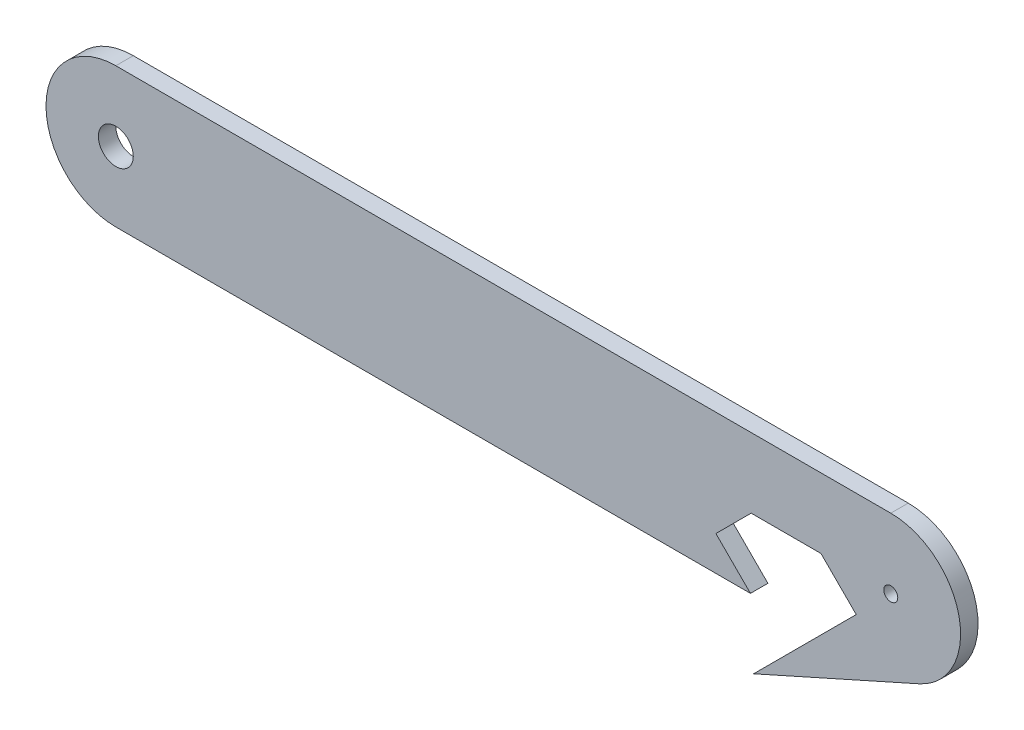
ISO-10303-21;
HEADER;
FILE_DESCRIPTION(('STEP AP214'),'2;1');
FILE_NAME('part.step','',(''),(''),'','','');
FILE_SCHEMA(('AUTOMOTIVE_DESIGN { 1 0 10303 214 1 1 1 1 }'));
ENDSEC;
DATA;
#1=APPLICATION_CONTEXT('core data for automotive mechanical design processes');
#2=APPLICATION_PROTOCOL_DEFINITION('international standard','automotive_design',2000,#1);
#3=PRODUCT_CONTEXT('',#1,'mechanical');
#4=PRODUCT('Part','Part','',(#3));
#5=PRODUCT_RELATED_PRODUCT_CATEGORY('part','',(#4));
#6=PRODUCT_DEFINITION_FORMATION('','',#4);
#7=PRODUCT_DEFINITION_CONTEXT('part definition',#1,'design');
#8=PRODUCT_DEFINITION('design','',#6,#7);
#9=PRODUCT_DEFINITION_SHAPE('','',#8);
#10=(LENGTH_UNIT() NAMED_UNIT(*) SI_UNIT(.MILLI.,.METRE.));
#11=(NAMED_UNIT(*) PLANE_ANGLE_UNIT() SI_UNIT($,.RADIAN.));
#12=(NAMED_UNIT(*) SI_UNIT($,.STERADIAN.) SOLID_ANGLE_UNIT());
#13=UNCERTAINTY_MEASURE_WITH_UNIT(LENGTH_MEASURE(1.E-05),#10,'distance_accuracy_value','');
#14=(GEOMETRIC_REPRESENTATION_CONTEXT(3) GLOBAL_UNCERTAINTY_ASSIGNED_CONTEXT((#13)) GLOBAL_UNIT_ASSIGNED_CONTEXT((#10,
#11,#12)) REPRESENTATION_CONTEXT('',''));
#15=CARTESIAN_POINT('',(0.,0.,0.));
#16=DIRECTION('',(0.,0.,1.));
#17=DIRECTION('',(1.,0.,0.));
#18=AXIS2_PLACEMENT_3D('',#15,#16,#17);
#19=CARTESIAN_POINT('',(140.97,0.,3.175));
#20=DIRECTION('',(0.,0.,1.));
#21=DIRECTION('',(1.,0.,0.));
#22=AXIS2_PLACEMENT_3D('',#19,#20,#21);
#23=PLANE('',#22);
#24=CARTESIAN_POINT('',(140.97,0.,3.175));
#25=DIRECTION('',(0.,0.,1.));
#26=DIRECTION('',(1.,0.,0.));
#27=AXIS2_PLACEMENT_3D('',#24,#25,#26);
#28=CIRCLE('',#27,1.27);
#29=CARTESIAN_POINT('',(142.24,0.,3.175));
#30=VERTEX_POINT('',#29);
#31=EDGE_CURVE('E158',#30,#30,#28,.T.);
#32=ORIENTED_EDGE('',*,*,#31,.F.);
#33=EDGE_LOOP('',(#32));
#34=FACE_BOUND('',#33,.T.);
#35=DIRECTION('',(1.,0.,0.));
#36=VECTOR('',#35,1.);
#37=CARTESIAN_POINT('',(0.,-12.7,3.175));
#38=LINE('',#37,#36);
#39=CARTESIAN_POINT('',(0.,-12.7,3.175));
#40=VERTEX_POINT('',#39);
#41=CARTESIAN_POINT('',(115.442358569436,-12.7,3.175));
#42=VERTEX_POINT('',#41);
#43=EDGE_CURVE('E182',#40,#42,#38,.T.);
#44=ORIENTED_EDGE('',*,*,#43,.T.);
#45=DIRECTION('',(-0.707106781183193,0.707106781189902,0.));
#46=VECTOR('',#45,1.);
#47=CARTESIAN_POINT('',(109.156179284717,-6.41382071522177,3.175));
#48=LINE('',#47,#46);
#49=CARTESIAN_POINT('',(109.156179284717,-6.41382071522177,3.175));
#50=VERTEX_POINT('',#49);
#51=EDGE_CURVE('E106',#42,#50,#48,.T.);
#52=ORIENTED_EDGE('',*,*,#51,.T.);
#53=DIRECTION('',(0.707106781189902,0.707106781183193,0.));
#54=VECTOR('',#53,1.);
#55=CARTESIAN_POINT('',(115.57,0.,3.175));
#56=LINE('',#55,#54);
#57=CARTESIAN_POINT('',(115.57,0.,3.175));
#58=VERTEX_POINT('',#57);
#59=EDGE_CURVE('E211',#50,#58,#56,.T.);
#60=ORIENTED_EDGE('',*,*,#59,.T.);
#61=DIRECTION('',(1.,0.,0.));
#62=VECTOR('',#61,1.);
#63=CARTESIAN_POINT('',(115.57,0.,3.175));
#64=LINE('',#63,#62);
#65=CARTESIAN_POINT('',(128.27,0.,3.175));
#66=VERTEX_POINT('',#65);
#67=EDGE_CURVE('E231',#58,#66,#64,.T.);
#68=ORIENTED_EDGE('',*,*,#67,.T.);
#69=DIRECTION('',(0.707106781183192,-0.707106781189903,0.));
#70=VECTOR('',#69,1.);
#71=CARTESIAN_POINT('',(134.68382071516,-6.41382071522073,3.175));
#72=LINE('',#71,#70);
#73=CARTESIAN_POINT('',(134.68382071516,-6.41382071522073,3.175));
#74=VERTEX_POINT('',#73);
#75=EDGE_CURVE('E227',#66,#74,#72,.T.);
#76=ORIENTED_EDGE('',*,*,#75,.T.);
#77=DIRECTION('',(-0.707106781189901,-0.707106781183194,0.));
#78=VECTOR('',#77,1.);
#79=CARTESIAN_POINT('',(134.68382071516,-6.41382071522073,3.175));
#80=LINE('',#79,#78);
#81=CARTESIAN_POINT('',(116.017803307922,-25.0798381222816,3.175));
#82=VERTEX_POINT('',#81);
#83=EDGE_CURVE('E230',#74,#82,#80,.T.);
#84=ORIENTED_EDGE('',*,*,#83,.T.);
#85=DIRECTION('',(0.912772440150221,0.408468447376553,0.));
#86=VECTOR('',#85,1.);
#87=CARTESIAN_POINT('',(116.017803307922,-25.0798381222816,3.175));
#88=LINE('',#87,#86);
#89=CARTESIAN_POINT('',(146.157549281682,-11.5922099899078,3.175));
#90=VERTEX_POINT('',#89);
#91=EDGE_CURVE('E131',#82,#90,#88,.T.);
#92=ORIENTED_EDGE('',*,*,#91,.T.);
#93=CARTESIAN_POINT('',(140.97,0.,3.175));
#94=DIRECTION('',(0.,0.,1.));
#95=DIRECTION('',(1.,0.,0.));
#96=AXIS2_PLACEMENT_3D('',#93,#94,#95);
#97=CIRCLE('',#96,12.7);
#98=CARTESIAN_POINT('',(140.97,12.7,3.175));
#99=VERTEX_POINT('',#98);
#100=EDGE_CURVE('E125',#90,#99,#97,.T.);
#101=ORIENTED_EDGE('',*,*,#100,.T.);
#102=DIRECTION('',(-1.,0.,0.));
#103=VECTOR('',#102,1.);
#104=CARTESIAN_POINT('',(0.,12.7,3.175));
#105=LINE('',#104,#103);
#106=CARTESIAN_POINT('',(0.,12.7,3.175));
#107=VERTEX_POINT('',#106);
#108=EDGE_CURVE('E129',#99,#107,#105,.T.);
#109=ORIENTED_EDGE('',*,*,#108,.T.);
#110=CARTESIAN_POINT('',(0.,0.,3.175));
#111=DIRECTION('',(0.,0.,1.));
#112=DIRECTION('',(1.,0.,0.));
#113=AXIS2_PLACEMENT_3D('',#110,#111,#112);
#114=CIRCLE('',#113,12.7);
#115=EDGE_CURVE('E57',#107,#40,#114,.T.);
#116=ORIENTED_EDGE('',*,*,#115,.T.);
#117=EDGE_LOOP('',(#44,#52,#60,#68,#76,#84,#92,#101,#109,#116));
#118=FACE_BOUND('',#117,.T.);
#119=CARTESIAN_POINT('',(0.,0.,3.175));
#120=DIRECTION('',(0.,0.,1.));
#121=DIRECTION('',(1.,0.,0.));
#122=AXIS2_PLACEMENT_3D('',#119,#120,#121);
#123=CIRCLE('',#122,3.175);
#124=CARTESIAN_POINT('',(3.175,0.,3.175));
#125=VERTEX_POINT('',#124);
#126=EDGE_CURVE('E249',#125,#125,#123,.T.);
#127=ORIENTED_EDGE('',*,*,#126,.F.);
#128=EDGE_LOOP('',(#127));
#129=FACE_BOUND('',#128,.T.);
#130=ADVANCED_FACE('F39',(#34,#118,#129),#23,.T.);
#131=CARTESIAN_POINT('',(140.97,0.,0.));
#132=DIRECTION('',(0.,0.,1.));
#133=DIRECTION('',(1.,0.,0.));
#134=AXIS2_PLACEMENT_3D('',#131,#132,#133);
#135=PLANE('',#134);
#136=DIRECTION('',(1.,0.,0.));
#137=VECTOR('',#136,1.);
#138=CARTESIAN_POINT('',(0.,-12.7,0.));
#139=LINE('',#138,#137);
#140=CARTESIAN_POINT('',(0.,-12.7,0.));
#141=VERTEX_POINT('',#140);
#142=CARTESIAN_POINT('',(115.442358569436,-12.7,0.));
#143=VERTEX_POINT('',#142);
#144=EDGE_CURVE('E153',#141,#143,#139,.T.);
#145=ORIENTED_EDGE('',*,*,#144,.F.);
#146=CARTESIAN_POINT('',(0.,0.,0.));
#147=DIRECTION('',(0.,0.,1.));
#148=DIRECTION('',(1.,0.,0.));
#149=AXIS2_PLACEMENT_3D('',#146,#147,#148);
#150=CIRCLE('',#149,12.7);
#151=CARTESIAN_POINT('',(0.,12.7,0.));
#152=VERTEX_POINT('',#151);
#153=EDGE_CURVE('E98',#152,#141,#150,.T.);
#154=ORIENTED_EDGE('',*,*,#153,.F.);
#155=DIRECTION('',(-1.,0.,0.));
#156=VECTOR('',#155,1.);
#157=CARTESIAN_POINT('',(0.,12.7,0.));
#158=LINE('',#157,#156);
#159=CARTESIAN_POINT('',(140.97,12.7,0.));
#160=VERTEX_POINT('',#159);
#161=EDGE_CURVE('E92',#160,#152,#158,.T.);
#162=ORIENTED_EDGE('',*,*,#161,.F.);
#163=CARTESIAN_POINT('',(140.97,0.,0.));
#164=DIRECTION('',(0.,0.,1.));
#165=DIRECTION('',(1.,0.,0.));
#166=AXIS2_PLACEMENT_3D('',#163,#164,#165);
#167=CIRCLE('',#166,12.7);
#168=CARTESIAN_POINT('',(146.157549281682,-11.5922099899078,0.));
#169=VERTEX_POINT('',#168);
#170=EDGE_CURVE('E140',#169,#160,#167,.T.);
#171=ORIENTED_EDGE('',*,*,#170,.F.);
#172=DIRECTION('',(0.912772440150221,0.408468447376553,0.));
#173=VECTOR('',#172,1.);
#174=CARTESIAN_POINT('',(116.017803307922,-25.0798381222816,0.));
#175=LINE('',#174,#173);
#176=CARTESIAN_POINT('',(116.017803307922,-25.0798381222816,0.));
#177=VERTEX_POINT('',#176);
#178=EDGE_CURVE('E173',#177,#169,#175,.T.);
#179=ORIENTED_EDGE('',*,*,#178,.F.);
#180=DIRECTION('',(-0.707106781189901,-0.707106781183194,0.));
#181=VECTOR('',#180,1.);
#182=CARTESIAN_POINT('',(134.68382071516,-6.41382071522073,0.));
#183=LINE('',#182,#181);
#184=CARTESIAN_POINT('',(134.68382071516,-6.41382071522073,0.));
#185=VERTEX_POINT('',#184);
#186=EDGE_CURVE('E170',#185,#177,#183,.T.);
#187=ORIENTED_EDGE('',*,*,#186,.F.);
#188=DIRECTION('',(0.707106781183192,-0.707106781189903,0.));
#189=VECTOR('',#188,1.);
#190=CARTESIAN_POINT('',(134.68382071516,-6.41382071522073,0.));
#191=LINE('',#190,#189);
#192=CARTESIAN_POINT('',(128.27,0.,0.));
#193=VERTEX_POINT('',#192);
#194=EDGE_CURVE('E167',#193,#185,#191,.T.);
#195=ORIENTED_EDGE('',*,*,#194,.F.);
#196=DIRECTION('',(1.,0.,0.));
#197=VECTOR('',#196,1.);
#198=CARTESIAN_POINT('',(115.57,0.,0.));
#199=LINE('',#198,#197);
#200=CARTESIAN_POINT('',(115.57,0.,0.));
#201=VERTEX_POINT('',#200);
#202=EDGE_CURVE('E164',#201,#193,#199,.T.);
#203=ORIENTED_EDGE('',*,*,#202,.F.);
#204=DIRECTION('',(0.707106781189902,0.707106781183193,0.));
#205=VECTOR('',#204,1.);
#206=CARTESIAN_POINT('',(115.57,0.,0.));
#207=LINE('',#206,#205);
#208=CARTESIAN_POINT('',(109.156179284717,-6.41382071522177,0.));
#209=VERTEX_POINT('',#208);
#210=EDGE_CURVE('E161',#209,#201,#207,.T.);
#211=ORIENTED_EDGE('',*,*,#210,.F.);
#212=DIRECTION('',(-0.707106781183193,0.707106781189902,0.));
#213=VECTOR('',#212,1.);
#214=CARTESIAN_POINT('',(109.156179284717,-6.41382071522177,0.));
#215=LINE('',#214,#213);
#216=EDGE_CURVE('E157',#143,#209,#215,.T.);
#217=ORIENTED_EDGE('',*,*,#216,.F.);
#218=EDGE_LOOP('',(#145,#154,#162,#171,#179,#187,#195,#203,#211,#217));
#219=FACE_BOUND('',#218,.T.);
#220=CARTESIAN_POINT('',(140.97,0.,0.));
#221=DIRECTION('',(0.,0.,1.));
#222=DIRECTION('',(1.,0.,0.));
#223=AXIS2_PLACEMENT_3D('',#220,#221,#222);
#224=CIRCLE('',#223,1.27);
#225=CARTESIAN_POINT('',(142.24,0.,0.));
#226=VERTEX_POINT('',#225);
#227=EDGE_CURVE('E245',#226,#226,#224,.T.);
#228=ORIENTED_EDGE('',*,*,#227,.T.);
#229=EDGE_LOOP('',(#228));
#230=FACE_BOUND('',#229,.T.);
#231=CARTESIAN_POINT('',(0.,0.,0.));
#232=DIRECTION('',(0.,0.,1.));
#233=DIRECTION('',(1.,0.,0.));
#234=AXIS2_PLACEMENT_3D('',#231,#232,#233);
#235=CIRCLE('',#234,3.175);
#236=CARTESIAN_POINT('',(3.175,0.,0.));
#237=VERTEX_POINT('',#236);
#238=EDGE_CURVE('E253',#237,#237,#235,.T.);
#239=ORIENTED_EDGE('',*,*,#238,.T.);
#240=EDGE_LOOP('',(#239));
#241=FACE_BOUND('',#240,.T.);
#242=ADVANCED_FACE('F215',(#219,#230,#241),#135,.F.);
#243=CARTESIAN_POINT('',(0.,-12.7,3.175));
#244=DIRECTION('',(0.,1.,0.));
#245=DIRECTION('',(0.,0.,1.));
#246=AXIS2_PLACEMENT_3D('',#243,#244,#245);
#247=PLANE('',#246);
#248=ORIENTED_EDGE('',*,*,#144,.T.);
#249=DIRECTION('',(0.,0.,-1.));
#250=VECTOR('',#249,1.);
#251=CARTESIAN_POINT('',(115.442358569436,-12.7,3.175));
#252=LINE('',#251,#250);
#253=EDGE_CURVE('E11',#42,#143,#252,.T.);
#254=ORIENTED_EDGE('',*,*,#253,.F.);
#255=ORIENTED_EDGE('',*,*,#43,.F.);
#256=DIRECTION('',(0.,0.,-1.));
#257=VECTOR('',#256,1.);
#258=CARTESIAN_POINT('',(0.,-12.7,3.175));
#259=LINE('',#258,#257);
#260=EDGE_CURVE('E149',#40,#141,#259,.T.);
#261=ORIENTED_EDGE('',*,*,#260,.T.);
#262=EDGE_LOOP('',(#248,#254,#255,#261));
#263=FACE_BOUND('',#262,.T.);
#264=ADVANCED_FACE('F41',(#263),#247,.F.);
#265=CARTESIAN_POINT('',(109.156179284717,-6.41382071522177,3.175));
#266=DIRECTION('',(-0.707106781189902,-0.707106781183193,0.));
#267=DIRECTION('',(0.707106781183193,-0.707106781189902,0.));
#268=AXIS2_PLACEMENT_3D('',#265,#266,#267);
#269=PLANE('',#268);
#270=ORIENTED_EDGE('',*,*,#216,.T.);
#271=DIRECTION('',(0.,0.,-1.));
#272=VECTOR('',#271,1.);
#273=CARTESIAN_POINT('',(109.156179284717,-6.41382071522177,3.175));
#274=LINE('',#273,#272);
#275=EDGE_CURVE('E49',#50,#209,#274,.T.);
#276=ORIENTED_EDGE('',*,*,#275,.F.);
#277=ORIENTED_EDGE('',*,*,#51,.F.);
#278=ORIENTED_EDGE('',*,*,#253,.T.);
#279=EDGE_LOOP('',(#270,#276,#277,#278));
#280=FACE_BOUND('',#279,.T.);
#281=ADVANCED_FACE('F295',(#280),#269,.F.);
#282=CARTESIAN_POINT('',(115.57,0.,3.175));
#283=DIRECTION('',(-0.707106781183193,0.707106781189902,0.));
#284=DIRECTION('',(-0.707106781189902,-0.707106781183193,0.));
#285=AXIS2_PLACEMENT_3D('',#282,#283,#284);
#286=PLANE('',#285);
#287=ORIENTED_EDGE('',*,*,#210,.T.);
#288=DIRECTION('',(0.,0.,-1.));
#289=VECTOR('',#288,1.);
#290=CARTESIAN_POINT('',(115.57,0.,3.175));
#291=LINE('',#290,#289);
#292=EDGE_CURVE('E201',#58,#201,#291,.T.);
#293=ORIENTED_EDGE('',*,*,#292,.F.);
#294=ORIENTED_EDGE('',*,*,#59,.F.);
#295=ORIENTED_EDGE('',*,*,#275,.T.);
#296=EDGE_LOOP('',(#287,#293,#294,#295));
#297=FACE_BOUND('',#296,.T.);
#298=ADVANCED_FACE('F209',(#297),#286,.F.);
#299=CARTESIAN_POINT('',(115.57,0.,3.175));
#300=DIRECTION('',(0.,1.,0.));
#301=DIRECTION('',(0.,0.,1.));
#302=AXIS2_PLACEMENT_3D('',#299,#300,#301);
#303=PLANE('',#302);
#304=ORIENTED_EDGE('',*,*,#202,.T.);
#305=DIRECTION('',(0.,0.,-1.));
#306=VECTOR('',#305,1.);
#307=CARTESIAN_POINT('',(128.27,0.,3.175));
#308=LINE('',#307,#306);
#309=EDGE_CURVE('E197',#66,#193,#308,.T.);
#310=ORIENTED_EDGE('',*,*,#309,.F.);
#311=ORIENTED_EDGE('',*,*,#67,.F.);
#312=ORIENTED_EDGE('',*,*,#292,.T.);
#313=EDGE_LOOP('',(#304,#310,#311,#312));
#314=FACE_BOUND('',#313,.T.);
#315=ADVANCED_FACE('F221',(#314),#303,.F.);
#316=CARTESIAN_POINT('',(134.68382071516,-6.41382071522073,3.175));
#317=DIRECTION('',(0.707106781189903,0.707106781183192,0.));
#318=DIRECTION('',(-0.707106781183192,0.707106781189903,0.));
#319=AXIS2_PLACEMENT_3D('',#316,#317,#318);
#320=PLANE('',#319);
#321=ORIENTED_EDGE('',*,*,#194,.T.);
#322=DIRECTION('',(0.,0.,-1.));
#323=VECTOR('',#322,1.);
#324=CARTESIAN_POINT('',(134.68382071516,-6.41382071522073,3.175));
#325=LINE('',#324,#323);
#326=EDGE_CURVE('E193',#74,#185,#325,.T.);
#327=ORIENTED_EDGE('',*,*,#326,.F.);
#328=ORIENTED_EDGE('',*,*,#75,.F.);
#329=ORIENTED_EDGE('',*,*,#309,.T.);
#330=EDGE_LOOP('',(#321,#327,#328,#329));
#331=FACE_BOUND('',#330,.T.);
#332=ADVANCED_FACE('F225',(#331),#320,.F.);
#333=CARTESIAN_POINT('',(134.68382071516,-6.41382071522073,3.175));
#334=DIRECTION('',(0.707106781183194,-0.707106781189901,0.));
#335=DIRECTION('',(0.707106781189901,0.707106781183194,0.));
#336=AXIS2_PLACEMENT_3D('',#333,#334,#335);
#337=PLANE('',#336);
#338=ORIENTED_EDGE('',*,*,#186,.T.);
#339=DIRECTION('',(0.,0.,-1.));
#340=VECTOR('',#339,1.);
#341=CARTESIAN_POINT('',(116.017803307922,-25.0798381222816,3.175));
#342=LINE('',#341,#340);
#343=EDGE_CURVE('E189',#82,#177,#342,.T.);
#344=ORIENTED_EDGE('',*,*,#343,.F.);
#345=ORIENTED_EDGE('',*,*,#83,.F.);
#346=ORIENTED_EDGE('',*,*,#326,.T.);
#347=EDGE_LOOP('',(#338,#344,#345,#346));
#348=FACE_BOUND('',#347,.T.);
#349=ADVANCED_FACE('F285',(#348),#337,.F.);
#350=CARTESIAN_POINT('',(116.017803307922,-25.0798381222816,3.175));
#351=DIRECTION('',(-0.408468447376553,0.91277244015022,0.));
#352=DIRECTION('',(-0.912772440150221,-0.408468447376553,0.));
#353=AXIS2_PLACEMENT_3D('',#350,#351,#352);
#354=PLANE('',#353);
#355=ORIENTED_EDGE('',*,*,#178,.T.);
#356=DIRECTION('',(0.,0.,-1.));
#357=VECTOR('',#356,1.);
#358=CARTESIAN_POINT('',(146.157549281682,-11.5922099899078,3.175));
#359=LINE('',#358,#357);
#360=EDGE_CURVE('E142',#90,#169,#359,.T.);
#361=ORIENTED_EDGE('',*,*,#360,.F.);
#362=ORIENTED_EDGE('',*,*,#91,.F.);
#363=ORIENTED_EDGE('',*,*,#343,.T.);
#364=EDGE_LOOP('',(#355,#361,#362,#363));
#365=FACE_BOUND('',#364,.T.);
#366=ADVANCED_FACE('F282',(#365),#354,.F.);
#367=CARTESIAN_POINT('',(140.97,0.,3.175));
#368=DIRECTION('',(0.,0.,-1.));
#369=DIRECTION('',(-1.,0.,0.));
#370=AXIS2_PLACEMENT_3D('',#367,#368,#369);
#371=CYLINDRICAL_SURFACE('',#370,12.7);
#372=ORIENTED_EDGE('',*,*,#170,.T.);
#373=DIRECTION('',(0.,0.,-1.));
#374=VECTOR('',#373,1.);
#375=CARTESIAN_POINT('',(140.97,12.7,3.175));
#376=LINE('',#375,#374);
#377=EDGE_CURVE('E137',#99,#160,#376,.T.);
#378=ORIENTED_EDGE('',*,*,#377,.F.);
#379=ORIENTED_EDGE('',*,*,#100,.F.);
#380=ORIENTED_EDGE('',*,*,#360,.T.);
#381=EDGE_LOOP('',(#372,#378,#379,#380));
#382=FACE_BOUND('',#381,.T.);
#383=ADVANCED_FACE('F138',(#382),#371,.T.);
#384=CARTESIAN_POINT('',(0.,12.7,3.175));
#385=DIRECTION('',(0.,-1.,0.));
#386=DIRECTION('',(0.,0.,-1.));
#387=AXIS2_PLACEMENT_3D('',#384,#385,#386);
#388=PLANE('',#387);
#389=ORIENTED_EDGE('',*,*,#161,.T.);
#390=DIRECTION('',(0.,0.,-1.));
#391=VECTOR('',#390,1.);
#392=CARTESIAN_POINT('',(0.,12.7,3.175));
#393=LINE('',#392,#391);
#394=EDGE_CURVE('E143',#107,#152,#393,.T.);
#395=ORIENTED_EDGE('',*,*,#394,.F.);
#396=ORIENTED_EDGE('',*,*,#108,.F.);
#397=ORIENTED_EDGE('',*,*,#377,.T.);
#398=EDGE_LOOP('',(#389,#395,#396,#397));
#399=FACE_BOUND('',#398,.T.);
#400=ADVANCED_FACE('F145',(#399),#388,.F.);
#401=CARTESIAN_POINT('',(0.,0.,3.175));
#402=DIRECTION('',(0.,0.,-1.));
#403=DIRECTION('',(-1.,0.,0.));
#404=AXIS2_PLACEMENT_3D('',#401,#402,#403);
#405=CYLINDRICAL_SURFACE('',#404,12.7);
#406=ORIENTED_EDGE('',*,*,#153,.T.);
#407=ORIENTED_EDGE('',*,*,#260,.F.);
#408=ORIENTED_EDGE('',*,*,#115,.F.);
#409=ORIENTED_EDGE('',*,*,#394,.T.);
#410=EDGE_LOOP('',(#406,#407,#408,#409));
#411=FACE_BOUND('',#410,.T.);
#412=ADVANCED_FACE('F275',(#411),#405,.T.);
#413=CARTESIAN_POINT('',(140.97,0.,3.175));
#414=DIRECTION('',(0.,0.,-1.));
#415=DIRECTION('',(-1.,0.,0.));
#416=AXIS2_PLACEMENT_3D('',#413,#414,#415);
#417=CYLINDRICAL_SURFACE('',#416,1.27);
#418=ORIENTED_EDGE('',*,*,#31,.T.);
#419=EDGE_LOOP('',(#418));
#420=FACE_BOUND('',#419,.T.);
#421=ORIENTED_EDGE('',*,*,#227,.F.);
#422=EDGE_LOOP('',(#421));
#423=FACE_BOUND('',#422,.T.);
#424=ADVANCED_FACE('F272',(#420,#423),#417,.F.);
#425=CARTESIAN_POINT('',(0.,0.,3.175));
#426=DIRECTION('',(0.,0.,-1.));
#427=DIRECTION('',(-1.,0.,0.));
#428=AXIS2_PLACEMENT_3D('',#425,#426,#427);
#429=CYLINDRICAL_SURFACE('',#428,3.175);
#430=ORIENTED_EDGE('',*,*,#126,.T.);
#431=EDGE_LOOP('',(#430));
#432=FACE_BOUND('',#431,.T.);
#433=ORIENTED_EDGE('',*,*,#238,.F.);
#434=EDGE_LOOP('',(#433));
#435=FACE_BOUND('',#434,.T.);
#436=ADVANCED_FACE('F261',(#432,#435),#429,.F.);
#437=CLOSED_SHELL('',(#130,#242,#264,#281,#298,#315,#332,#349,#366,#383,#400,#412,#424,#436));
#438=MANIFOLD_SOLID_BREP('B2',#437);
#439=ADVANCED_BREP_SHAPE_REPRESENTATION('',(#18,#438),#14);
#440=SHAPE_DEFINITION_REPRESENTATION(#9,#439);
ENDSEC;
END-ISO-10303-21;
